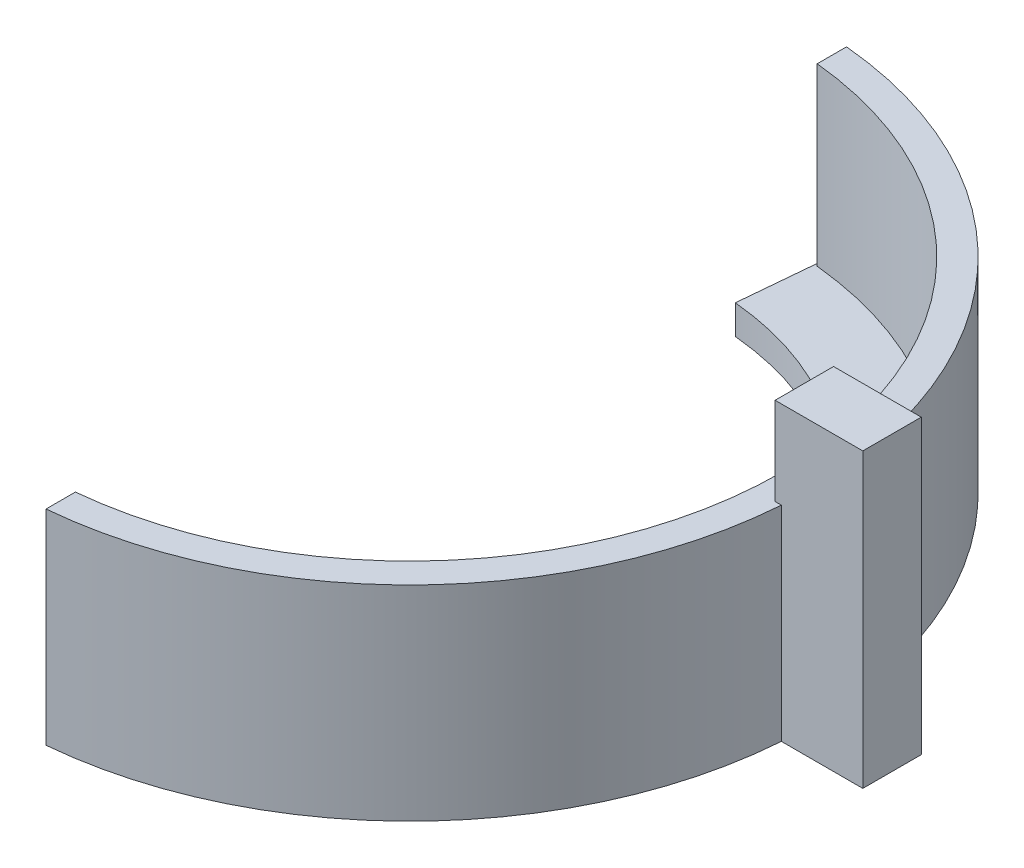
ISO-10303-21;
HEADER;
FILE_DESCRIPTION(('STEP AP214'),'2;1');
FILE_NAME('part.step','',(''),(''),'','','');
FILE_SCHEMA(('AUTOMOTIVE_DESIGN { 1 0 10303 214 1 1 1 1 }'));
ENDSEC;
DATA;
#1=APPLICATION_CONTEXT('core data for automotive mechanical design processes');
#2=APPLICATION_PROTOCOL_DEFINITION('international standard','automotive_design',2000,#1);
#3=PRODUCT_CONTEXT('',#1,'mechanical');
#4=PRODUCT('Part','Part','',(#3));
#5=PRODUCT_RELATED_PRODUCT_CATEGORY('part','',(#4));
#6=PRODUCT_DEFINITION_FORMATION('','',#4);
#7=PRODUCT_DEFINITION_CONTEXT('part definition',#1,'design');
#8=PRODUCT_DEFINITION('design','',#6,#7);
#9=PRODUCT_DEFINITION_SHAPE('','',#8);
#10=(LENGTH_UNIT() NAMED_UNIT(*) SI_UNIT(.MILLI.,.METRE.));
#11=(NAMED_UNIT(*) PLANE_ANGLE_UNIT() SI_UNIT($,.RADIAN.));
#12=(NAMED_UNIT(*) SI_UNIT($,.STERADIAN.) SOLID_ANGLE_UNIT());
#13=UNCERTAINTY_MEASURE_WITH_UNIT(LENGTH_MEASURE(1.E-05),#10,'distance_accuracy_value','');
#14=(GEOMETRIC_REPRESENTATION_CONTEXT(3) GLOBAL_UNCERTAINTY_ASSIGNED_CONTEXT((#13)) GLOBAL_UNIT_ASSIGNED_CONTEXT((#10,
#11,#12)) REPRESENTATION_CONTEXT('',''));
#15=CARTESIAN_POINT('',(0.,0.,0.));
#16=DIRECTION('',(0.,0.,1.));
#17=DIRECTION('',(1.,0.,0.));
#18=AXIS2_PLACEMENT_3D('',#15,#16,#17);
#19=CARTESIAN_POINT('',(0.,12.,0.));
#20=DIRECTION('',(0.,-1.,0.));
#21=DIRECTION('',(0.,0.,-1.));
#22=AXIS2_PLACEMENT_3D('',#19,#20,#21);
#23=CYLINDRICAL_SURFACE('',#22,27.5);
#24=CARTESIAN_POINT('',(0.,12.,0.));
#25=DIRECTION('',(0.,1.,0.));
#26=DIRECTION('',(0.,0.,1.));
#27=AXIS2_PLACEMENT_3D('',#24,#25,#26);
#28=CIRCLE('',#27,27.5);
#29=CARTESIAN_POINT('',(27.427176303805,12.,-2.));
#30=VERTEX_POINT('',#29);
#31=CARTESIAN_POINT('',(2.5,12.,-27.3861278752583));
#32=VERTEX_POINT('',#31);
#33=EDGE_CURVE('E246',#30,#32,#28,.T.);
#34=ORIENTED_EDGE('',*,*,#33,.F.);
#35=DIRECTION('',(0.,-1.,0.));
#36=VECTOR('',#35,1.);
#37=CARTESIAN_POINT('',(27.427176303805,12.,-2.));
#38=LINE('',#37,#36);
#39=CARTESIAN_POINT('',(27.427176303805,-2.,-2.));
#40=VERTEX_POINT('',#39);
#41=EDGE_CURVE('E197',#30,#40,#38,.T.);
#42=ORIENTED_EDGE('',*,*,#41,.T.);
#43=CARTESIAN_POINT('',(0.,-2.,0.));
#44=DIRECTION('',(0.,1.,0.));
#45=DIRECTION('',(0.,0.,-1.));
#46=AXIS2_PLACEMENT_3D('',#43,#44,#45);
#47=CIRCLE('',#46,27.5);
#48=CARTESIAN_POINT('',(2.5,-2.,-27.3861278752583));
#49=VERTEX_POINT('',#48);
#50=EDGE_CURVE('E205',#40,#49,#47,.T.);
#51=ORIENTED_EDGE('',*,*,#50,.T.);
#52=DIRECTION('',(0.,1.,0.));
#53=VECTOR('',#52,1.);
#54=CARTESIAN_POINT('',(2.5,-2.,-27.3861278752583));
#55=LINE('',#54,#53);
#56=CARTESIAN_POINT('',(2.5,0.,-27.3861278752583));
#57=VERTEX_POINT('',#56);
#58=EDGE_CURVE('E217',#49,#57,#55,.T.);
#59=ORIENTED_EDGE('',*,*,#58,.T.);
#60=DIRECTION('',(0.,-1.,0.));
#61=VECTOR('',#60,1.);
#62=CARTESIAN_POINT('',(2.5,12.,-27.3861278752583));
#63=LINE('',#62,#61);
#64=EDGE_CURVE('E11',#32,#57,#63,.T.);
#65=ORIENTED_EDGE('',*,*,#64,.F.);
#66=EDGE_LOOP('',(#34,#42,#51,#59,#65));
#67=FACE_BOUND('',#66,.T.);
#68=ADVANCED_FACE('F39',(#67),#23,.T.);
#69=CARTESIAN_POINT('',(2.5,-2.,27.3861278752583));
#70=VERTEX_POINT('',#69);
#71=CARTESIAN_POINT('',(27.427176303805,-2.,2.));
#72=VERTEX_POINT('',#71);
#73=EDGE_CURVE('E201',#70,#72,#47,.T.);
#74=ORIENTED_EDGE('',*,*,#73,.T.);
#75=DIRECTION('',(0.,-1.,0.));
#76=VECTOR('',#75,1.);
#77=CARTESIAN_POINT('',(27.427176303805,12.,2.));
#78=LINE('',#77,#76);
#79=CARTESIAN_POINT('',(27.427176303805,12.,2.));
#80=VERTEX_POINT('',#79);
#81=EDGE_CURVE('E188',#72,#80,#78,.F.);
#82=ORIENTED_EDGE('',*,*,#81,.T.);
#83=CARTESIAN_POINT('',(2.5,12.,27.3861278752583));
#84=VERTEX_POINT('',#83);
#85=EDGE_CURVE('E242',#84,#80,#28,.T.);
#86=ORIENTED_EDGE('',*,*,#85,.F.);
#87=DIRECTION('',(0.,-1.,0.));
#88=VECTOR('',#87,1.);
#89=CARTESIAN_POINT('',(2.5,12.,27.3861278752583));
#90=LINE('',#89,#88);
#91=CARTESIAN_POINT('',(2.5,0.,27.3861278752583));
#92=VERTEX_POINT('',#91);
#93=EDGE_CURVE('E255',#84,#92,#90,.T.);
#94=ORIENTED_EDGE('',*,*,#93,.T.);
#95=DIRECTION('',(0.,1.,0.));
#96=VECTOR('',#95,1.);
#97=CARTESIAN_POINT('',(2.5,-2.,27.3861278752583));
#98=LINE('',#97,#96);
#99=EDGE_CURVE('E229',#70,#92,#98,.T.);
#100=ORIENTED_EDGE('',*,*,#99,.F.);
#101=EDGE_LOOP('',(#74,#82,#86,#94,#100));
#102=FACE_BOUND('',#101,.T.);
#103=ADVANCED_FACE('F41',(#102),#23,.T.);
#104=CARTESIAN_POINT('',(2.5,12.,-27.3861278752583));
#105=DIRECTION('',(1.,0.,0.));
#106=DIRECTION('',(0.,0.,-1.));
#107=AXIS2_PLACEMENT_3D('',#104,#105,#106);
#108=PLANE('',#107);
#109=DIRECTION('',(0.,0.,1.));
#110=VECTOR('',#109,1.);
#111=CARTESIAN_POINT('',(2.5,0.,-27.3861278752583));
#112=LINE('',#111,#110);
#113=CARTESIAN_POINT('',(2.5,0.,-25.377155080899));
#114=VERTEX_POINT('',#113);
#115=EDGE_CURVE('E232',#57,#114,#112,.T.);
#116=ORIENTED_EDGE('',*,*,#115,.T.);
#117=DIRECTION('',(0.,-1.,0.));
#118=VECTOR('',#117,1.);
#119=CARTESIAN_POINT('',(2.5,12.,-25.377155080899));
#120=LINE('',#119,#118);
#121=CARTESIAN_POINT('',(2.5,12.,-25.377155080899));
#122=VERTEX_POINT('',#121);
#123=EDGE_CURVE('E48',#122,#114,#120,.T.);
#124=ORIENTED_EDGE('',*,*,#123,.F.);
#125=DIRECTION('',(0.,0.,1.));
#126=VECTOR('',#125,1.);
#127=CARTESIAN_POINT('',(2.5,12.,-27.3861278752583));
#128=LINE('',#127,#126);
#129=EDGE_CURVE('E245',#32,#122,#128,.T.);
#130=ORIENTED_EDGE('',*,*,#129,.F.);
#131=ORIENTED_EDGE('',*,*,#64,.T.);
#132=EDGE_LOOP('',(#116,#124,#130,#131));
#133=FACE_BOUND('',#132,.T.);
#134=ADVANCED_FACE('F282',(#133),#108,.F.);
#135=CARTESIAN_POINT('',(0.,12.,0.));
#136=DIRECTION('',(0.,-1.,0.));
#137=DIRECTION('',(0.,0.,-1.));
#138=AXIS2_PLACEMENT_3D('',#135,#136,#137);
#139=CYLINDRICAL_SURFACE('',#138,25.5);
#140=CARTESIAN_POINT('',(0.,0.,0.));
#141=DIRECTION('',(0.,-1.,0.));
#142=DIRECTION('',(0.,0.,1.));
#143=AXIS2_PLACEMENT_3D('',#140,#141,#142);
#144=CIRCLE('',#143,25.5);
#145=CARTESIAN_POINT('',(2.5,0.,25.377155080899));
#146=VERTEX_POINT('',#145);
#147=EDGE_CURVE('E259',#114,#146,#144,.T.);
#148=ORIENTED_EDGE('',*,*,#147,.T.);
#149=DIRECTION('',(0.,-1.,0.));
#150=VECTOR('',#149,1.);
#151=CARTESIAN_POINT('',(2.5,12.,25.377155080899));
#152=LINE('',#151,#150);
#153=CARTESIAN_POINT('',(2.5,12.,25.377155080899));
#154=VERTEX_POINT('',#153);
#155=EDGE_CURVE('E270',#154,#146,#152,.T.);
#156=ORIENTED_EDGE('',*,*,#155,.F.);
#157=CARTESIAN_POINT('',(0.,12.,0.));
#158=DIRECTION('',(0.,-1.,0.));
#159=DIRECTION('',(0.,0.,1.));
#160=AXIS2_PLACEMENT_3D('',#157,#158,#159);
#161=CIRCLE('',#160,25.5);
#162=EDGE_CURVE('E249',#122,#154,#161,.T.);
#163=ORIENTED_EDGE('',*,*,#162,.F.);
#164=ORIENTED_EDGE('',*,*,#123,.T.);
#165=EDGE_LOOP('',(#148,#156,#163,#164));
#166=FACE_BOUND('',#165,.T.);
#167=ADVANCED_FACE('F278',(#166),#139,.F.);
#168=CARTESIAN_POINT('',(2.5,12.,25.377155080899));
#169=DIRECTION('',(1.,0.,0.));
#170=DIRECTION('',(0.,0.,-1.));
#171=AXIS2_PLACEMENT_3D('',#168,#169,#170);
#172=PLANE('',#171);
#173=DIRECTION('',(0.,0.,1.));
#174=VECTOR('',#173,1.);
#175=CARTESIAN_POINT('',(2.5,0.,25.377155080899));
#176=LINE('',#175,#174);
#177=EDGE_CURVE('E263',#146,#92,#176,.T.);
#178=ORIENTED_EDGE('',*,*,#177,.T.);
#179=ORIENTED_EDGE('',*,*,#93,.F.);
#180=DIRECTION('',(0.,0.,1.));
#181=VECTOR('',#180,1.);
#182=CARTESIAN_POINT('',(2.5,12.,25.377155080899));
#183=LINE('',#182,#181);
#184=EDGE_CURVE('E252',#154,#84,#183,.T.);
#185=ORIENTED_EDGE('',*,*,#184,.F.);
#186=ORIENTED_EDGE('',*,*,#155,.T.);
#187=EDGE_LOOP('',(#178,#179,#185,#186));
#188=FACE_BOUND('',#187,.T.);
#189=ADVANCED_FACE('F317',(#188),#172,.F.);
#190=CARTESIAN_POINT('',(0.,12.,0.));
#191=DIRECTION('',(0.,1.,0.));
#192=DIRECTION('',(0.,0.,1.));
#193=AXIS2_PLACEMENT_3D('',#190,#191,#192);
#194=PLANE('',#193);
#195=DIRECTION('',(-1.,0.,0.));
#196=VECTOR('',#195,1.);
#197=CARTESIAN_POINT('',(0.,12.,-2.));
#198=LINE('',#197,#196);
#199=CARTESIAN_POINT('',(27.,12.,-2.));
#200=VERTEX_POINT('',#199);
#201=EDGE_CURVE('E194',#30,#200,#198,.T.);
#202=ORIENTED_EDGE('',*,*,#201,.F.);
#203=ORIENTED_EDGE('',*,*,#33,.T.);
#204=ORIENTED_EDGE('',*,*,#129,.T.);
#205=ORIENTED_EDGE('',*,*,#162,.T.);
#206=ORIENTED_EDGE('',*,*,#184,.T.);
#207=ORIENTED_EDGE('',*,*,#85,.T.);
#208=DIRECTION('',(1.,0.,0.));
#209=VECTOR('',#208,1.);
#210=CARTESIAN_POINT('',(0.,12.,2.));
#211=LINE('',#210,#209);
#212=CARTESIAN_POINT('',(27.,12.,2.));
#213=VERTEX_POINT('',#212);
#214=EDGE_CURVE('E60',#213,#80,#211,.T.);
#215=ORIENTED_EDGE('',*,*,#214,.F.);
#216=DIRECTION('',(0.,0.,1.));
#217=VECTOR('',#216,1.);
#218=CARTESIAN_POINT('',(27.,12.,0.));
#219=LINE('',#218,#217);
#220=EDGE_CURVE('E55',#200,#213,#219,.T.);
#221=ORIENTED_EDGE('',*,*,#220,.F.);
#222=EDGE_LOOP('',(#202,#203,#204,#205,#206,#207,#215,#221));
#223=FACE_BOUND('',#222,.T.);
#224=ADVANCED_FACE('F314',(#223),#194,.T.);
#225=CARTESIAN_POINT('',(2.5,-2.,27.3861278752583));
#226=DIRECTION('',(-0.995859195463938,0.,0.0909090909090909));
#227=DIRECTION('',(0.0909090909090909,0.,0.995859195463938));
#228=AXIS2_PLACEMENT_3D('',#225,#226,#227);
#229=PLANE('',#228);
#230=DIRECTION('',(0.0909090909090909,0.,0.995859195463938));
#231=VECTOR('',#230,1.);
#232=CARTESIAN_POINT('',(2.5,0.,27.3861278752583));
#233=LINE('',#232,#231);
#234=CARTESIAN_POINT('',(1.86363636363636,0.,20.4151135070107));
#235=VERTEX_POINT('',#234);
#236=EDGE_CURVE('E225',#235,#92,#233,.T.);
#237=ORIENTED_EDGE('',*,*,#236,.F.);
#238=DIRECTION('',(0.,1.,0.));
#239=VECTOR('',#238,1.);
#240=CARTESIAN_POINT('',(1.86363636363636,-2.,20.4151135070107));
#241=LINE('',#240,#239);
#242=CARTESIAN_POINT('',(1.86363636363636,-2.,20.4151135070107));
#243=VERTEX_POINT('',#242);
#244=EDGE_CURVE('E233',#243,#235,#241,.T.);
#245=ORIENTED_EDGE('',*,*,#244,.F.);
#246=DIRECTION('',(0.0909090909090909,0.,0.995859195463938));
#247=VECTOR('',#246,1.);
#248=CARTESIAN_POINT('',(2.5,-2.,27.3861278752583));
#249=LINE('',#248,#247);
#250=EDGE_CURVE('E213',#243,#70,#249,.T.);
#251=ORIENTED_EDGE('',*,*,#250,.T.);
#252=ORIENTED_EDGE('',*,*,#99,.T.);
#253=EDGE_LOOP('',(#237,#245,#251,#252));
#254=FACE_BOUND('',#253,.T.);
#255=ADVANCED_FACE('F300',(#254),#229,.T.);
#256=CARTESIAN_POINT('',(0.,-2.,0.));
#257=DIRECTION('',(0.,1.,0.));
#258=DIRECTION('',(0.,0.,1.));
#259=AXIS2_PLACEMENT_3D('',#256,#257,#258);
#260=CYLINDRICAL_SURFACE('',#259,20.5);
#261=CARTESIAN_POINT('',(0.,0.,0.));
#262=DIRECTION('',(0.,-1.,0.));
#263=DIRECTION('',(0.,0.,-1.));
#264=AXIS2_PLACEMENT_3D('',#261,#262,#263);
#265=CIRCLE('',#264,20.5);
#266=CARTESIAN_POINT('',(1.86363636363637,0.,-20.4151135070107));
#267=VERTEX_POINT('',#266);
#268=EDGE_CURVE('E221',#267,#235,#265,.T.);
#269=ORIENTED_EDGE('',*,*,#268,.F.);
#270=DIRECTION('',(0.,1.,0.));
#271=VECTOR('',#270,1.);
#272=CARTESIAN_POINT('',(1.86363636363637,-2.,-20.4151135070107));
#273=LINE('',#272,#271);
#274=CARTESIAN_POINT('',(1.86363636363637,-2.,-20.4151135070107));
#275=VERTEX_POINT('',#274);
#276=EDGE_CURVE('E236',#275,#267,#273,.T.);
#277=ORIENTED_EDGE('',*,*,#276,.F.);
#278=CARTESIAN_POINT('',(0.,-2.,0.));
#279=DIRECTION('',(0.,-1.,0.));
#280=DIRECTION('',(0.,0.,-1.));
#281=AXIS2_PLACEMENT_3D('',#278,#279,#280);
#282=CIRCLE('',#281,20.5);
#283=EDGE_CURVE('E209',#275,#243,#282,.T.);
#284=ORIENTED_EDGE('',*,*,#283,.T.);
#285=ORIENTED_EDGE('',*,*,#244,.T.);
#286=EDGE_LOOP('',(#269,#277,#284,#285));
#287=FACE_BOUND('',#286,.T.);
#288=ADVANCED_FACE('F297',(#287),#260,.F.);
#289=CARTESIAN_POINT('',(2.5,-2.,-27.3861278752583));
#290=DIRECTION('',(-0.995859195463939,0.,-0.0909090909090895));
#291=DIRECTION('',(-0.0909090909090895,0.,0.995859195463939));
#292=AXIS2_PLACEMENT_3D('',#289,#290,#291);
#293=PLANE('',#292);
#294=DIRECTION('',(-0.0909090909090895,0.,0.995859195463939));
#295=VECTOR('',#294,1.);
#296=CARTESIAN_POINT('',(2.5,0.,-27.3861278752583));
#297=LINE('',#296,#295);
#298=EDGE_CURVE('E200',#57,#267,#297,.T.);
#299=ORIENTED_EDGE('',*,*,#298,.F.);
#300=ORIENTED_EDGE('',*,*,#58,.F.);
#301=DIRECTION('',(-0.0909090909090895,0.,0.995859195463939));
#302=VECTOR('',#301,1.);
#303=CARTESIAN_POINT('',(2.5,-2.,-27.3861278752583));
#304=LINE('',#303,#302);
#305=EDGE_CURVE('E204',#49,#275,#304,.T.);
#306=ORIENTED_EDGE('',*,*,#305,.T.);
#307=ORIENTED_EDGE('',*,*,#276,.T.);
#308=EDGE_LOOP('',(#299,#300,#306,#307));
#309=FACE_BOUND('',#308,.T.);
#310=ADVANCED_FACE('F293',(#309),#293,.T.);
#311=CARTESIAN_POINT('',(0.,-2.,0.));
#312=DIRECTION('',(0.,-1.,0.));
#313=DIRECTION('',(0.,0.,-1.));
#314=AXIS2_PLACEMENT_3D('',#311,#312,#313);
#315=PLANE('',#314);
#316=ORIENTED_EDGE('',*,*,#50,.F.);
#317=DIRECTION('',(1.,0.,0.));
#318=VECTOR('',#317,1.);
#319=CARTESIAN_POINT('',(27.,-2.,-2.));
#320=LINE('',#319,#318);
#321=CARTESIAN_POINT('',(33.,-2.,-2.));
#322=VERTEX_POINT('',#321);
#323=EDGE_CURVE('E164',#40,#322,#320,.T.);
#324=ORIENTED_EDGE('',*,*,#323,.T.);
#325=DIRECTION('',(0.,0.,1.));
#326=VECTOR('',#325,1.);
#327=CARTESIAN_POINT('',(33.,-2.,-2.));
#328=LINE('',#327,#326);
#329=CARTESIAN_POINT('',(33.,-2.,2.));
#330=VERTEX_POINT('',#329);
#331=EDGE_CURVE('E173',#322,#330,#328,.T.);
#332=ORIENTED_EDGE('',*,*,#331,.T.);
#333=DIRECTION('',(-1.,0.,0.));
#334=VECTOR('',#333,1.);
#335=CARTESIAN_POINT('',(27.,-2.,2.));
#336=LINE('',#335,#334);
#337=EDGE_CURVE('E140',#330,#72,#336,.T.);
#338=ORIENTED_EDGE('',*,*,#337,.T.);
#339=ORIENTED_EDGE('',*,*,#73,.F.);
#340=ORIENTED_EDGE('',*,*,#250,.F.);
#341=ORIENTED_EDGE('',*,*,#283,.F.);
#342=ORIENTED_EDGE('',*,*,#305,.F.);
#343=EDGE_LOOP('',(#316,#324,#332,#338,#339,#340,#341,#342));
#344=FACE_BOUND('',#343,.T.);
#345=ADVANCED_FACE('F307',(#344),#315,.T.);
#346=CARTESIAN_POINT('',(0.,0.,0.));
#347=DIRECTION('',(0.,-1.,0.));
#348=DIRECTION('',(0.,0.,-1.));
#349=AXIS2_PLACEMENT_3D('',#346,#347,#348);
#350=PLANE('',#349);
#351=ORIENTED_EDGE('',*,*,#177,.F.);
#352=ORIENTED_EDGE('',*,*,#147,.F.);
#353=ORIENTED_EDGE('',*,*,#115,.F.);
#354=ORIENTED_EDGE('',*,*,#298,.T.);
#355=ORIENTED_EDGE('',*,*,#268,.T.);
#356=ORIENTED_EDGE('',*,*,#236,.T.);
#357=EDGE_LOOP('',(#351,#352,#353,#354,#355,#356));
#358=FACE_BOUND('',#357,.T.);
#359=ADVANCED_FACE('F285',(#358),#350,.F.);
#360=CARTESIAN_POINT('',(27.,18.,-2.));
#361=DIRECTION('',(0.,0.,-1.));
#362=DIRECTION('',(-1.,0.,0.));
#363=AXIS2_PLACEMENT_3D('',#360,#361,#362);
#364=PLANE('',#363);
#365=ORIENTED_EDGE('',*,*,#41,.F.);
#366=ORIENTED_EDGE('',*,*,#201,.T.);
#367=DIRECTION('',(0.,-1.,0.));
#368=VECTOR('',#367,1.);
#369=CARTESIAN_POINT('',(27.,18.,-2.));
#370=LINE('',#369,#368);
#371=CARTESIAN_POINT('',(27.,18.,-2.));
#372=VERTEX_POINT('',#371);
#373=EDGE_CURVE('E180',#372,#200,#370,.T.);
#374=ORIENTED_EDGE('',*,*,#373,.F.);
#375=DIRECTION('',(1.,0.,0.));
#376=VECTOR('',#375,1.);
#377=CARTESIAN_POINT('',(27.,18.,-2.));
#378=LINE('',#377,#376);
#379=CARTESIAN_POINT('',(33.,18.,-2.));
#380=VERTEX_POINT('',#379);
#381=EDGE_CURVE('E147',#372,#380,#378,.T.);
#382=ORIENTED_EDGE('',*,*,#381,.T.);
#383=DIRECTION('',(0.,-1.,0.));
#384=VECTOR('',#383,1.);
#385=CARTESIAN_POINT('',(33.,18.,-2.));
#386=LINE('',#385,#384);
#387=EDGE_CURVE('E162',#380,#322,#386,.T.);
#388=ORIENTED_EDGE('',*,*,#387,.T.);
#389=ORIENTED_EDGE('',*,*,#323,.F.);
#390=EDGE_LOOP('',(#365,#366,#374,#382,#388,#389));
#391=FACE_BOUND('',#390,.T.);
#392=ADVANCED_FACE('F311',(#391),#364,.T.);
#393=CARTESIAN_POINT('',(27.,18.,2.));
#394=DIRECTION('',(0.,0.,1.));
#395=DIRECTION('',(1.,0.,0.));
#396=AXIS2_PLACEMENT_3D('',#393,#394,#395);
#397=PLANE('',#396);
#398=ORIENTED_EDGE('',*,*,#81,.F.);
#399=ORIENTED_EDGE('',*,*,#337,.F.);
#400=DIRECTION('',(0.,-1.,0.));
#401=VECTOR('',#400,1.);
#402=CARTESIAN_POINT('',(33.,18.,2.));
#403=LINE('',#402,#401);
#404=CARTESIAN_POINT('',(33.,18.,2.));
#405=VERTEX_POINT('',#404);
#406=EDGE_CURVE('E133',#405,#330,#403,.T.);
#407=ORIENTED_EDGE('',*,*,#406,.F.);
#408=DIRECTION('',(-1.,0.,0.));
#409=VECTOR('',#408,1.);
#410=CARTESIAN_POINT('',(27.,18.,2.));
#411=LINE('',#410,#409);
#412=CARTESIAN_POINT('',(27.,18.,2.));
#413=VERTEX_POINT('',#412);
#414=EDGE_CURVE('E138',#405,#413,#411,.T.);
#415=ORIENTED_EDGE('',*,*,#414,.T.);
#416=DIRECTION('',(0.,-1.,0.));
#417=VECTOR('',#416,1.);
#418=CARTESIAN_POINT('',(27.,18.,2.));
#419=LINE('',#418,#417);
#420=EDGE_CURVE('E146',#413,#213,#419,.T.);
#421=ORIENTED_EDGE('',*,*,#420,.T.);
#422=ORIENTED_EDGE('',*,*,#214,.T.);
#423=EDGE_LOOP('',(#398,#399,#407,#415,#421,#422));
#424=FACE_BOUND('',#423,.T.);
#425=ADVANCED_FACE('F136',(#424),#397,.T.);
#426=CARTESIAN_POINT('',(33.,18.,-2.));
#427=DIRECTION('',(1.,0.,0.));
#428=DIRECTION('',(0.,0.,-1.));
#429=AXIS2_PLACEMENT_3D('',#426,#427,#428);
#430=PLANE('',#429);
#431=ORIENTED_EDGE('',*,*,#331,.F.);
#432=ORIENTED_EDGE('',*,*,#387,.F.);
#433=DIRECTION('',(0.,0.,1.));
#434=VECTOR('',#433,1.);
#435=CARTESIAN_POINT('',(33.,18.,-2.));
#436=LINE('',#435,#434);
#437=EDGE_CURVE('E154',#380,#405,#436,.T.);
#438=ORIENTED_EDGE('',*,*,#437,.T.);
#439=ORIENTED_EDGE('',*,*,#406,.T.);
#440=EDGE_LOOP('',(#431,#432,#438,#439));
#441=FACE_BOUND('',#440,.T.);
#442=ADVANCED_FACE('F160',(#441),#430,.T.);
#443=CARTESIAN_POINT('',(27.,18.,-2.));
#444=DIRECTION('',(-1.,0.,0.));
#445=DIRECTION('',(0.,0.,1.));
#446=AXIS2_PLACEMENT_3D('',#443,#444,#445);
#447=PLANE('',#446);
#448=ORIENTED_EDGE('',*,*,#373,.T.);
#449=ORIENTED_EDGE('',*,*,#220,.T.);
#450=ORIENTED_EDGE('',*,*,#420,.F.);
#451=DIRECTION('',(0.,0.,-1.));
#452=VECTOR('',#451,1.);
#453=CARTESIAN_POINT('',(27.,18.,-2.));
#454=LINE('',#453,#452);
#455=EDGE_CURVE('E157',#413,#372,#454,.T.);
#456=ORIENTED_EDGE('',*,*,#455,.T.);
#457=EDGE_LOOP('',(#448,#449,#450,#456));
#458=FACE_BOUND('',#457,.T.);
#459=ADVANCED_FACE('F313',(#458),#447,.T.);
#460=CARTESIAN_POINT('',(0.,18.,0.));
#461=DIRECTION('',(0.,1.,0.));
#462=DIRECTION('',(0.,0.,1.));
#463=AXIS2_PLACEMENT_3D('',#460,#461,#462);
#464=PLANE('',#463);
#465=ORIENTED_EDGE('',*,*,#437,.F.);
#466=ORIENTED_EDGE('',*,*,#381,.F.);
#467=ORIENTED_EDGE('',*,*,#455,.F.);
#468=ORIENTED_EDGE('',*,*,#414,.F.);
#469=EDGE_LOOP('',(#465,#466,#467,#468));
#470=FACE_BOUND('',#469,.T.);
#471=ADVANCED_FACE('F152',(#470),#464,.T.);
#472=CLOSED_SHELL('',(#68,#103,#134,#167,#189,#224,#255,#288,#310,#345,#359,#392,#425,#442,#459,#471));
#473=MANIFOLD_SOLID_BREP('B2',#472);
#474=ADVANCED_BREP_SHAPE_REPRESENTATION('',(#18,#473),#14);
#475=SHAPE_DEFINITION_REPRESENTATION(#9,#474);
ENDSEC;
END-ISO-10303-21;
